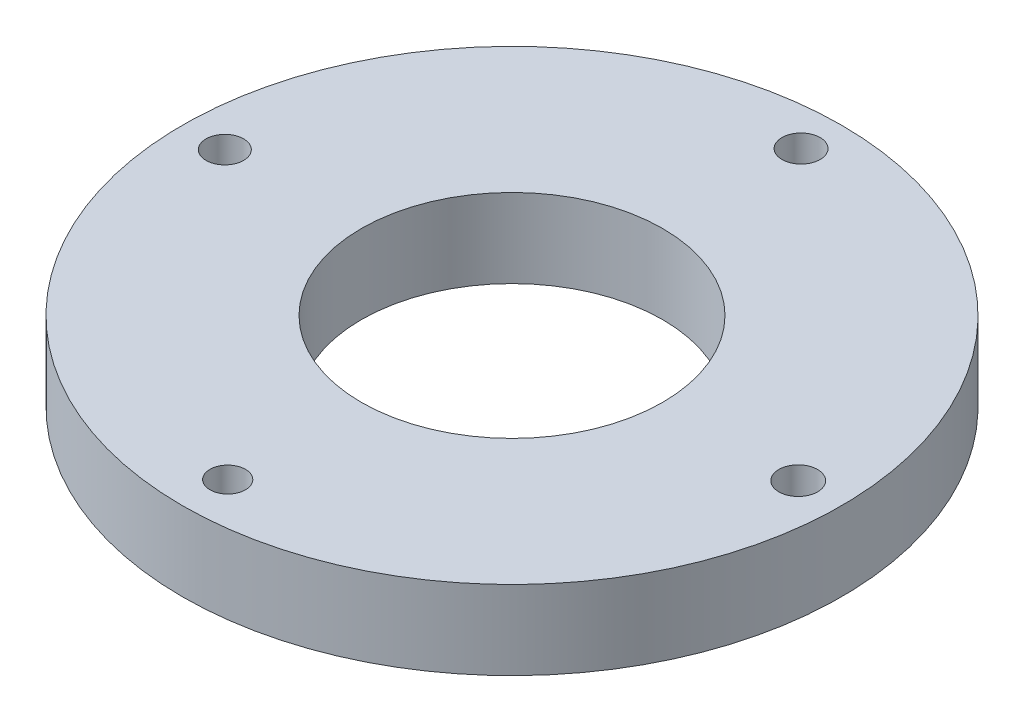
ISO-10303-21;
HEADER;
FILE_DESCRIPTION(('STEP AP214'),'2;1');
FILE_NAME('part.step','',(''),(''),'','','');
FILE_SCHEMA(('AUTOMOTIVE_DESIGN { 1 0 10303 214 1 1 1 1 }'));
ENDSEC;
DATA;
#1=APPLICATION_CONTEXT('core data for automotive mechanical design processes');
#2=APPLICATION_PROTOCOL_DEFINITION('international standard','automotive_design',2000,#1);
#3=PRODUCT_CONTEXT('',#1,'mechanical');
#4=PRODUCT('Part','Part','',(#3));
#5=PRODUCT_RELATED_PRODUCT_CATEGORY('part','',(#4));
#6=PRODUCT_DEFINITION_FORMATION('','',#4);
#7=PRODUCT_DEFINITION_CONTEXT('part definition',#1,'design');
#8=PRODUCT_DEFINITION('design','',#6,#7);
#9=PRODUCT_DEFINITION_SHAPE('','',#8);
#10=(LENGTH_UNIT() NAMED_UNIT(*) SI_UNIT(.MILLI.,.METRE.));
#11=(NAMED_UNIT(*) PLANE_ANGLE_UNIT() SI_UNIT($,.RADIAN.));
#12=(NAMED_UNIT(*) SI_UNIT($,.STERADIAN.) SOLID_ANGLE_UNIT());
#13=UNCERTAINTY_MEASURE_WITH_UNIT(LENGTH_MEASURE(1.E-05),#10,'distance_accuracy_value','');
#14=(GEOMETRIC_REPRESENTATION_CONTEXT(3) GLOBAL_UNCERTAINTY_ASSIGNED_CONTEXT((#13)) GLOBAL_UNIT_ASSIGNED_CONTEXT((#10,
#11,#12)) REPRESENTATION_CONTEXT('',''));
#15=CARTESIAN_POINT('',(0.,0.,0.));
#16=DIRECTION('',(0.,0.,1.));
#17=DIRECTION('',(1.,0.,0.));
#18=AXIS2_PLACEMENT_3D('',#15,#16,#17);
#19=CARTESIAN_POINT('',(0.,6.,0.));
#20=DIRECTION('',(0.,-1.,0.));
#21=DIRECTION('',(0.,0.,-1.));
#22=AXIS2_PLACEMENT_3D('',#19,#20,#21);
#23=CYLINDRICAL_SURFACE('',#22,25.05);
#24=CARTESIAN_POINT('',(0.,6.,0.));
#25=DIRECTION('',(0.,1.,0.));
#26=DIRECTION('',(0.,0.,1.));
#27=AXIS2_PLACEMENT_3D('',#24,#25,#26);
#28=CIRCLE('',#27,25.05);
#29=CARTESIAN_POINT('',(0.,6.,25.05));
#30=VERTEX_POINT('',#29);
#31=EDGE_CURVE('E10',#30,#30,#28,.T.);
#32=ORIENTED_EDGE('',*,*,#31,.F.);
#33=EDGE_LOOP('',(#32));
#34=FACE_BOUND('',#33,.T.);
#35=CARTESIAN_POINT('',(0.,0.,0.));
#36=DIRECTION('',(0.,1.,0.));
#37=DIRECTION('',(0.,0.,1.));
#38=AXIS2_PLACEMENT_3D('',#35,#36,#37);
#39=CIRCLE('',#38,25.05);
#40=CARTESIAN_POINT('',(0.,0.,25.05));
#41=VERTEX_POINT('',#40);
#42=EDGE_CURVE('E40',#41,#41,#39,.T.);
#43=ORIENTED_EDGE('',*,*,#42,.T.);
#44=EDGE_LOOP('',(#43));
#45=FACE_BOUND('',#44,.T.);
#46=ADVANCED_FACE('F37',(#34,#45),#23,.T.);
#47=CARTESIAN_POINT('',(0.,6.,0.));
#48=DIRECTION('',(0.,1.,0.));
#49=DIRECTION('',(0.,0.,1.));
#50=AXIS2_PLACEMENT_3D('',#47,#48,#49);
#51=PLANE('',#50);
#52=CARTESIAN_POINT('',(21.754981042673,6.,0.));
#53=DIRECTION('',(0.,1.,0.));
#54=DIRECTION('',(0.,0.,1.));
#55=AXIS2_PLACEMENT_3D('',#52,#53,#54);
#56=CIRCLE('',#55,1.475);
#57=CARTESIAN_POINT('',(21.754981042673,6.,1.475));
#58=VERTEX_POINT('',#57);
#59=EDGE_CURVE('E62',#58,#58,#56,.T.);
#60=ORIENTED_EDGE('',*,*,#59,.F.);
#61=EDGE_LOOP('',(#60));
#62=FACE_BOUND('',#61,.T.);
#63=CARTESIAN_POINT('',(0.,6.,0.));
#64=DIRECTION('',(0.,1.,0.));
#65=DIRECTION('',(0.,0.,1.));
#66=AXIS2_PLACEMENT_3D('',#63,#64,#65);
#67=CIRCLE('',#66,11.45);
#68=CARTESIAN_POINT('',(0.,6.,11.45));
#69=VERTEX_POINT('',#68);
#70=EDGE_CURVE('E66',#69,#69,#67,.T.);
#71=ORIENTED_EDGE('',*,*,#70,.F.);
#72=EDGE_LOOP('',(#71));
#73=FACE_BOUND('',#72,.T.);
#74=CARTESIAN_POINT('',(0.,6.,21.609462774829));
#75=DIRECTION('',(0.,1.,0.));
#76=DIRECTION('',(0.,0.,1.));
#77=AXIS2_PLACEMENT_3D('',#74,#75,#76);
#78=CIRCLE('',#77,1.35);
#79=CARTESIAN_POINT('',(0.,6.,22.959462774829));
#80=VERTEX_POINT('',#79);
#81=EDGE_CURVE('E53',#80,#80,#78,.T.);
#82=ORIENTED_EDGE('',*,*,#81,.F.);
#83=EDGE_LOOP('',(#82));
#84=FACE_BOUND('',#83,.T.);
#85=CARTESIAN_POINT('',(-21.827740176595,6.,0.));
#86=DIRECTION('',(0.,1.,0.));
#87=DIRECTION('',(0.,0.,1.));
#88=AXIS2_PLACEMENT_3D('',#85,#86,#87);
#89=CIRCLE('',#88,1.425);
#90=CARTESIAN_POINT('',(-21.827740176595,6.,1.425));
#91=VERTEX_POINT('',#90);
#92=EDGE_CURVE('E52',#91,#91,#89,.T.);
#93=ORIENTED_EDGE('',*,*,#92,.F.);
#94=EDGE_LOOP('',(#93));
#95=FACE_BOUND('',#94,.T.);
#96=CARTESIAN_POINT('',(0.,6.,-21.9732584444389));
#97=DIRECTION('',(0.,1.,0.));
#98=DIRECTION('',(0.,0.,1.));
#99=AXIS2_PLACEMENT_3D('',#96,#97,#98);
#100=CIRCLE('',#99,1.45);
#101=CARTESIAN_POINT('',(0.,6.,-20.5232584444389));
#102=VERTEX_POINT('',#101);
#103=EDGE_CURVE('E59',#102,#102,#100,.T.);
#104=ORIENTED_EDGE('',*,*,#103,.F.);
#105=EDGE_LOOP('',(#104));
#106=FACE_BOUND('',#105,.T.);
#107=ORIENTED_EDGE('',*,*,#31,.T.);
#108=EDGE_LOOP('',(#107));
#109=FACE_BOUND('',#108,.T.);
#110=ADVANCED_FACE('F89',(#62,#73,#84,#95,#106,#109),#51,.T.);
#111=CARTESIAN_POINT('',(0.,0.,0.));
#112=DIRECTION('',(0.,1.,0.));
#113=DIRECTION('',(0.,0.,1.));
#114=AXIS2_PLACEMENT_3D('',#111,#112,#113);
#115=PLANE('',#114);
#116=CARTESIAN_POINT('',(21.754981042673,0.,0.));
#117=DIRECTION('',(0.,1.,0.));
#118=DIRECTION('',(0.,0.,1.));
#119=AXIS2_PLACEMENT_3D('',#116,#117,#118);
#120=CIRCLE('',#119,1.475);
#121=CARTESIAN_POINT('',(21.754981042673,0.,1.475));
#122=VERTEX_POINT('',#121);
#123=EDGE_CURVE('E47',#122,#122,#120,.T.);
#124=ORIENTED_EDGE('',*,*,#123,.T.);
#125=EDGE_LOOP('',(#124));
#126=FACE_BOUND('',#125,.T.);
#127=CARTESIAN_POINT('',(0.,0.,0.));
#128=DIRECTION('',(0.,1.,0.));
#129=DIRECTION('',(0.,0.,1.));
#130=AXIS2_PLACEMENT_3D('',#127,#128,#129);
#131=CIRCLE('',#130,11.45);
#132=CARTESIAN_POINT('',(0.,0.,11.45));
#133=VERTEX_POINT('',#132);
#134=EDGE_CURVE('E63',#133,#133,#131,.T.);
#135=ORIENTED_EDGE('',*,*,#134,.T.);
#136=EDGE_LOOP('',(#135));
#137=FACE_BOUND('',#136,.T.);
#138=CARTESIAN_POINT('',(0.,0.,21.609462774829));
#139=DIRECTION('',(0.,1.,0.));
#140=DIRECTION('',(0.,0.,1.));
#141=AXIS2_PLACEMENT_3D('',#138,#139,#140);
#142=CIRCLE('',#141,1.35);
#143=CARTESIAN_POINT('',(0.,0.,22.959462774829));
#144=VERTEX_POINT('',#143);
#145=EDGE_CURVE('E69',#144,#144,#142,.T.);
#146=ORIENTED_EDGE('',*,*,#145,.T.);
#147=EDGE_LOOP('',(#146));
#148=FACE_BOUND('',#147,.T.);
#149=CARTESIAN_POINT('',(-21.827740176595,0.,0.));
#150=DIRECTION('',(0.,1.,0.));
#151=DIRECTION('',(0.,0.,1.));
#152=AXIS2_PLACEMENT_3D('',#149,#150,#151);
#153=CIRCLE('',#152,1.425);
#154=CARTESIAN_POINT('',(-21.827740176595,0.,1.425));
#155=VERTEX_POINT('',#154);
#156=EDGE_CURVE('E49',#155,#155,#153,.T.);
#157=ORIENTED_EDGE('',*,*,#156,.T.);
#158=EDGE_LOOP('',(#157));
#159=FACE_BOUND('',#158,.T.);
#160=CARTESIAN_POINT('',(0.,0.,-21.9732584444389));
#161=DIRECTION('',(0.,1.,0.));
#162=DIRECTION('',(0.,0.,1.));
#163=AXIS2_PLACEMENT_3D('',#160,#161,#162);
#164=CIRCLE('',#163,1.45);
#165=CARTESIAN_POINT('',(0.,0.,-20.5232584444389));
#166=VERTEX_POINT('',#165);
#167=EDGE_CURVE('E56',#166,#166,#164,.T.);
#168=ORIENTED_EDGE('',*,*,#167,.T.);
#169=EDGE_LOOP('',(#168));
#170=FACE_BOUND('',#169,.T.);
#171=ORIENTED_EDGE('',*,*,#42,.F.);
#172=EDGE_LOOP('',(#171));
#173=FACE_BOUND('',#172,.T.);
#174=ADVANCED_FACE('F79',(#126,#137,#148,#159,#170,#173),#115,.F.);
#175=CARTESIAN_POINT('',(0.,0.,-21.9732584444389));
#176=DIRECTION('',(0.,1.,0.));
#177=DIRECTION('',(0.,0.,1.));
#178=AXIS2_PLACEMENT_3D('',#175,#176,#177);
#179=CYLINDRICAL_SURFACE('',#178,1.45);
#180=ORIENTED_EDGE('',*,*,#167,.F.);
#181=EDGE_LOOP('',(#180));
#182=FACE_BOUND('',#181,.T.);
#183=ORIENTED_EDGE('',*,*,#103,.T.);
#184=EDGE_LOOP('',(#183));
#185=FACE_BOUND('',#184,.T.);
#186=ADVANCED_FACE('F101',(#182,#185),#179,.F.);
#187=CARTESIAN_POINT('',(-21.827740176595,0.,0.));
#188=DIRECTION('',(0.,1.,0.));
#189=DIRECTION('',(0.,0.,1.));
#190=AXIS2_PLACEMENT_3D('',#187,#188,#189);
#191=CYLINDRICAL_SURFACE('',#190,1.425);
#192=ORIENTED_EDGE('',*,*,#156,.F.);
#193=EDGE_LOOP('',(#192));
#194=FACE_BOUND('',#193,.T.);
#195=ORIENTED_EDGE('',*,*,#92,.T.);
#196=EDGE_LOOP('',(#195));
#197=FACE_BOUND('',#196,.T.);
#198=ADVANCED_FACE('F103',(#194,#197),#191,.F.);
#199=CARTESIAN_POINT('',(0.,0.,21.609462774829));
#200=DIRECTION('',(0.,1.,0.));
#201=DIRECTION('',(0.,0.,1.));
#202=AXIS2_PLACEMENT_3D('',#199,#200,#201);
#203=CYLINDRICAL_SURFACE('',#202,1.35);
#204=ORIENTED_EDGE('',*,*,#145,.F.);
#205=EDGE_LOOP('',(#204));
#206=FACE_BOUND('',#205,.T.);
#207=ORIENTED_EDGE('',*,*,#81,.T.);
#208=EDGE_LOOP('',(#207));
#209=FACE_BOUND('',#208,.T.);
#210=ADVANCED_FACE('F110',(#206,#209),#203,.F.);
#211=CARTESIAN_POINT('',(0.,0.,0.));
#212=DIRECTION('',(0.,1.,0.));
#213=DIRECTION('',(0.,0.,1.));
#214=AXIS2_PLACEMENT_3D('',#211,#212,#213);
#215=CYLINDRICAL_SURFACE('',#214,11.45);
#216=ORIENTED_EDGE('',*,*,#134,.F.);
#217=EDGE_LOOP('',(#216));
#218=FACE_BOUND('',#217,.T.);
#219=ORIENTED_EDGE('',*,*,#70,.T.);
#220=EDGE_LOOP('',(#219));
#221=FACE_BOUND('',#220,.T.);
#222=ADVANCED_FACE('F85',(#218,#221),#215,.F.);
#223=CARTESIAN_POINT('',(21.754981042673,0.,0.));
#224=DIRECTION('',(0.,1.,0.));
#225=DIRECTION('',(0.,0.,1.));
#226=AXIS2_PLACEMENT_3D('',#223,#224,#225);
#227=CYLINDRICAL_SURFACE('',#226,1.475);
#228=ORIENTED_EDGE('',*,*,#123,.F.);
#229=EDGE_LOOP('',(#228));
#230=FACE_BOUND('',#229,.T.);
#231=ORIENTED_EDGE('',*,*,#59,.T.);
#232=EDGE_LOOP('',(#231));
#233=FACE_BOUND('',#232,.T.);
#234=ADVANCED_FACE('F82',(#230,#233),#227,.F.);
#235=CLOSED_SHELL('',(#46,#110,#174,#186,#198,#210,#222,#234));
#236=MANIFOLD_SOLID_BREP('B2',#235);
#237=ADVANCED_BREP_SHAPE_REPRESENTATION('',(#18,#236),#14);
#238=SHAPE_DEFINITION_REPRESENTATION(#9,#237);
ENDSEC;
END-ISO-10303-21;
